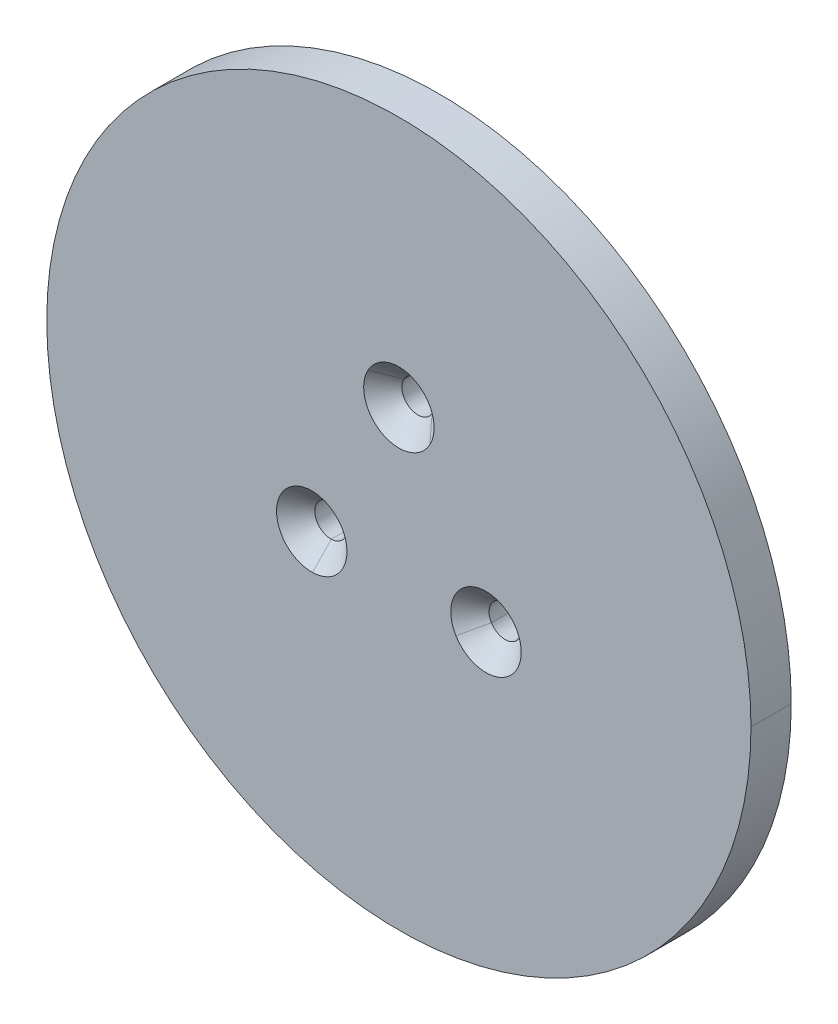
ISO-10303-21;
HEADER;
FILE_DESCRIPTION(('STEP AP214'),'2;1');
FILE_NAME('part.step','',(''),(''),'','','');
FILE_SCHEMA(('AUTOMOTIVE_DESIGN { 1 0 10303 214 1 1 1 1 }'));
ENDSEC;
DATA;
#1=APPLICATION_CONTEXT('core data for automotive mechanical design processes');
#2=APPLICATION_PROTOCOL_DEFINITION('international standard','automotive_design',2000,#1);
#3=PRODUCT_CONTEXT('',#1,'mechanical');
#4=PRODUCT('Part','Part','',(#3));
#5=PRODUCT_RELATED_PRODUCT_CATEGORY('part','',(#4));
#6=PRODUCT_DEFINITION_FORMATION('','',#4);
#7=PRODUCT_DEFINITION_CONTEXT('part definition',#1,'design');
#8=PRODUCT_DEFINITION('design','',#6,#7);
#9=PRODUCT_DEFINITION_SHAPE('','',#8);
#10=(LENGTH_UNIT() NAMED_UNIT(*) SI_UNIT(.MILLI.,.METRE.));
#11=(NAMED_UNIT(*) PLANE_ANGLE_UNIT() SI_UNIT($,.RADIAN.));
#12=(NAMED_UNIT(*) SI_UNIT($,.STERADIAN.) SOLID_ANGLE_UNIT());
#13=UNCERTAINTY_MEASURE_WITH_UNIT(LENGTH_MEASURE(1.E-05),#10,'distance_accuracy_value','');
#14=(GEOMETRIC_REPRESENTATION_CONTEXT(3) GLOBAL_UNCERTAINTY_ASSIGNED_CONTEXT((#13)) GLOBAL_UNIT_ASSIGNED_CONTEXT((#10,
#11,#12)) REPRESENTATION_CONTEXT('',''));
#15=CARTESIAN_POINT('',(0.,0.,0.));
#16=DIRECTION('',(0.,0.,1.));
#17=DIRECTION('',(1.,0.,0.));
#18=AXIS2_PLACEMENT_3D('',#15,#16,#17);
#19=CARTESIAN_POINT('',(0.,10.,2.1));
#20=DIRECTION('',(0.,0.,1.));
#21=DIRECTION('',(1.,0.,0.));
#22=AXIS2_PLACEMENT_3D('',#19,#20,#21);
#23=CONICAL_SURFACE('',#22,1.6,0.785398163397448);
#24=CARTESIAN_POINT('',(0.,10.,4.));
#25=DIRECTION('',(0.,0.,1.));
#26=DIRECTION('',(1.,0.,0.));
#27=AXIS2_PLACEMENT_3D('',#24,#25,#26);
#28=CIRCLE('',#27,3.5);
#29=CARTESIAN_POINT('',(3.0715389666163,8.32201061488529,4.));
#30=VERTEX_POINT('',#29);
#31=CARTESIAN_POINT('',(-3.07153896661631,11.6779893851147,4.));
#32=VERTEX_POINT('',#31);
#33=EDGE_CURVE('E10',#30,#32,#28,.T.);
#34=ORIENTED_EDGE('',*,*,#33,.T.);
#35=DIRECTION('',(-0.620544580563746,0.339005049421044,0.707106781186548));
#36=VECTOR('',#35,1.);
#37=CARTESIAN_POINT('',(-2.29988999087683,11.2564356283828,3.12071067811865));
#38=LINE('',#37,#36);
#39=CARTESIAN_POINT('',(-1.4041320990246,10.7670808617667,2.1));
#40=VERTEX_POINT('',#39);
#41=EDGE_CURVE('E40',#40,#32,#38,.T.);
#42=ORIENTED_EDGE('',*,*,#41,.F.);
#43=CARTESIAN_POINT('',(0.,10.,2.1));
#44=DIRECTION('',(0.,0.,-1.));
#45=DIRECTION('',(1.,0.,0.));
#46=AXIS2_PLACEMENT_3D('',#43,#44,#45);
#47=CIRCLE('',#46,1.6);
#48=CARTESIAN_POINT('',(1.40413209902459,9.23291913823327,2.1));
#49=VERTEX_POINT('',#48);
#50=EDGE_CURVE('E25',#40,#49,#47,.T.);
#51=ORIENTED_EDGE('',*,*,#50,.T.);
#52=DIRECTION('',(0.620544580563746,-0.339005049421045,0.707106781186548));
#53=VECTOR('',#52,1.);
#54=CARTESIAN_POINT('',(2.29988999087682,8.74356437161718,3.12071067811865));
#55=LINE('',#54,#53);
#56=EDGE_CURVE('E101',#49,#30,#55,.T.);
#57=ORIENTED_EDGE('',*,*,#56,.T.);
#58=EDGE_LOOP('',(#34,#42,#51,#57));
#59=FACE_BOUND('',#58,.T.);
#60=ADVANCED_FACE('F15',(#59),#23,.F.);
#61=CARTESIAN_POINT('',(0.,10.,2.1));
#62=DIRECTION('',(0.,0.,1.));
#63=DIRECTION('',(1.,0.,0.));
#64=AXIS2_PLACEMENT_3D('',#61,#62,#63);
#65=CONICAL_SURFACE('',#64,1.6,0.785398163397448);
#66=CARTESIAN_POINT('',(0.,10.,4.));
#67=DIRECTION('',(0.,0.,1.));
#68=DIRECTION('',(1.,0.,0.));
#69=AXIS2_PLACEMENT_3D('',#66,#67,#68);
#70=CIRCLE('',#69,3.5);
#71=EDGE_CURVE('E192',#32,#30,#70,.T.);
#72=ORIENTED_EDGE('',*,*,#71,.T.);
#73=ORIENTED_EDGE('',*,*,#56,.F.);
#74=CARTESIAN_POINT('',(0.,10.,2.1));
#75=DIRECTION('',(0.,0.,-1.));
#76=DIRECTION('',(1.,0.,0.));
#77=AXIS2_PLACEMENT_3D('',#74,#75,#76);
#78=CIRCLE('',#77,1.6);
#79=EDGE_CURVE('E91',#49,#40,#78,.T.);
#80=ORIENTED_EDGE('',*,*,#79,.T.);
#81=ORIENTED_EDGE('',*,*,#41,.T.);
#82=EDGE_LOOP('',(#72,#73,#80,#81));
#83=FACE_BOUND('',#82,.T.);
#84=ADVANCED_FACE('F312',(#83),#65,.F.);
#85=CARTESIAN_POINT('',(0.,10.,3.9));
#86=DIRECTION('',(0.,0.,1.));
#87=DIRECTION('',(1.,0.,0.));
#88=AXIS2_PLACEMENT_3D('',#85,#86,#87);
#89=CYLINDRICAL_SURFACE('',#88,1.6);
#90=CARTESIAN_POINT('',(0.,10.,0.));
#91=DIRECTION('',(0.,0.,1.));
#92=DIRECTION('',(1.,0.,0.));
#93=AXIS2_PLACEMENT_3D('',#90,#91,#92);
#94=CIRCLE('',#93,1.6);
#95=CARTESIAN_POINT('',(1.40413209902459,9.23291913823327,0.));
#96=VERTEX_POINT('',#95);
#97=CARTESIAN_POINT('',(-1.4041320990246,10.7670808617667,0.));
#98=VERTEX_POINT('',#97);
#99=EDGE_CURVE('E220',#96,#98,#94,.T.);
#100=ORIENTED_EDGE('',*,*,#99,.F.);
#101=DIRECTION('',(0.,0.,1.));
#102=VECTOR('',#101,1.);
#103=CARTESIAN_POINT('',(1.40413209902459,9.23291913823327,0.894999999975));
#104=LINE('',#103,#102);
#105=EDGE_CURVE('E207',#96,#49,#104,.T.);
#106=ORIENTED_EDGE('',*,*,#105,.T.);
#107=ORIENTED_EDGE('',*,*,#50,.F.);
#108=DIRECTION('',(0.,0.,1.));
#109=VECTOR('',#108,1.);
#110=CARTESIAN_POINT('',(-1.4041320990246,10.7670808617667,0.894999999975));
#111=LINE('',#110,#109);
#112=EDGE_CURVE('E189',#98,#40,#111,.T.);
#113=ORIENTED_EDGE('',*,*,#112,.F.);
#114=EDGE_LOOP('',(#100,#106,#107,#113));
#115=FACE_BOUND('',#114,.T.);
#116=ADVANCED_FACE('F267',(#115),#89,.F.);
#117=CARTESIAN_POINT('',(0.,10.,3.9));
#118=DIRECTION('',(0.,0.,1.));
#119=DIRECTION('',(1.,0.,0.));
#120=AXIS2_PLACEMENT_3D('',#117,#118,#119);
#121=CYLINDRICAL_SURFACE('',#120,1.6);
#122=CARTESIAN_POINT('',(0.,10.,0.));
#123=DIRECTION('',(0.,0.,1.));
#124=DIRECTION('',(1.,0.,0.));
#125=AXIS2_PLACEMENT_3D('',#122,#123,#124);
#126=CIRCLE('',#125,1.6);
#127=EDGE_CURVE('E216',#98,#96,#126,.T.);
#128=ORIENTED_EDGE('',*,*,#127,.F.);
#129=ORIENTED_EDGE('',*,*,#112,.T.);
#130=ORIENTED_EDGE('',*,*,#79,.F.);
#131=ORIENTED_EDGE('',*,*,#105,.F.);
#132=EDGE_LOOP('',(#128,#129,#130,#131));
#133=FACE_BOUND('',#132,.T.);
#134=ADVANCED_FACE('F320',(#133),#121,.F.);
#135=CARTESIAN_POINT('',(0.,0.,2.));
#136=DIRECTION('',(0.,0.,-1.));
#137=DIRECTION('',(1.,0.,0.));
#138=AXIS2_PLACEMENT_3D('',#135,#136,#137);
#139=CYLINDRICAL_SURFACE('',#138,35.);
#140=DIRECTION('',(0.,0.,1.));
#141=VECTOR('',#140,1.);
#142=CARTESIAN_POINT('',(35.,0.,2.));
#143=LINE('',#142,#141);
#144=CARTESIAN_POINT('',(35.,0.,0.));
#145=VERTEX_POINT('',#144);
#146=CARTESIAN_POINT('',(35.,0.,4.));
#147=VERTEX_POINT('',#146);
#148=EDGE_CURVE('E183',#145,#147,#143,.T.);
#149=ORIENTED_EDGE('',*,*,#148,.F.);
#150=CARTESIAN_POINT('',(0.,0.,0.));
#151=DIRECTION('',(0.,0.,1.));
#152=DIRECTION('',(1.,0.,0.));
#153=AXIS2_PLACEMENT_3D('',#150,#151,#152);
#154=CIRCLE('',#153,35.);
#155=CARTESIAN_POINT('',(-35.,0.,0.));
#156=VERTEX_POINT('',#155);
#157=EDGE_CURVE('E185',#145,#156,#154,.T.);
#158=ORIENTED_EDGE('',*,*,#157,.T.);
#159=DIRECTION('',(0.,0.,1.));
#160=VECTOR('',#159,1.);
#161=CARTESIAN_POINT('',(-35.,0.,2.));
#162=LINE('',#161,#160);
#163=CARTESIAN_POINT('',(-35.,0.,4.));
#164=VERTEX_POINT('',#163);
#165=EDGE_CURVE('E190',#156,#164,#162,.T.);
#166=ORIENTED_EDGE('',*,*,#165,.T.);
#167=CARTESIAN_POINT('',(0.,0.,4.));
#168=DIRECTION('',(0.,0.,1.));
#169=DIRECTION('',(1.,0.,0.));
#170=AXIS2_PLACEMENT_3D('',#167,#168,#169);
#171=CIRCLE('',#170,35.);
#172=EDGE_CURVE('E200',#147,#164,#171,.T.);
#173=ORIENTED_EDGE('',*,*,#172,.F.);
#174=EDGE_LOOP('',(#149,#158,#166,#173));
#175=FACE_BOUND('',#174,.T.);
#176=ADVANCED_FACE('F303',(#175),#139,.T.);
#177=CARTESIAN_POINT('',(0.,0.,2.));
#178=DIRECTION('',(0.,0.,-1.));
#179=DIRECTION('',(1.,0.,0.));
#180=AXIS2_PLACEMENT_3D('',#177,#178,#179);
#181=CYLINDRICAL_SURFACE('',#180,35.);
#182=ORIENTED_EDGE('',*,*,#165,.F.);
#183=CARTESIAN_POINT('',(0.,0.,0.));
#184=DIRECTION('',(0.,0.,1.));
#185=DIRECTION('',(1.,0.,0.));
#186=AXIS2_PLACEMENT_3D('',#183,#184,#185);
#187=CIRCLE('',#186,35.);
#188=EDGE_CURVE('E209',#156,#145,#187,.T.);
#189=ORIENTED_EDGE('',*,*,#188,.T.);
#190=ORIENTED_EDGE('',*,*,#148,.T.);
#191=CARTESIAN_POINT('',(0.,0.,4.));
#192=DIRECTION('',(0.,0.,1.));
#193=DIRECTION('',(1.,0.,0.));
#194=AXIS2_PLACEMENT_3D('',#191,#192,#193);
#195=CIRCLE('',#194,35.);
#196=EDGE_CURVE('E196',#164,#147,#195,.T.);
#197=ORIENTED_EDGE('',*,*,#196,.F.);
#198=EDGE_LOOP('',(#182,#189,#190,#197));
#199=FACE_BOUND('',#198,.T.);
#200=ADVANCED_FACE('F293',(#199),#181,.T.);
#201=CARTESIAN_POINT('',(0.,0.,0.));
#202=DIRECTION('',(0.,0.,1.));
#203=DIRECTION('',(1.,0.,0.));
#204=AXIS2_PLACEMENT_3D('',#201,#202,#203);
#205=PLANE('',#204);
#206=ORIENTED_EDGE('',*,*,#188,.F.);
#207=ORIENTED_EDGE('',*,*,#157,.F.);
#208=EDGE_LOOP('',(#206,#207));
#209=FACE_BOUND('',#208,.T.);
#210=ORIENTED_EDGE('',*,*,#99,.T.);
#211=ORIENTED_EDGE('',*,*,#127,.T.);
#212=EDGE_LOOP('',(#210,#211));
#213=FACE_BOUND('',#212,.T.);
#214=CARTESIAN_POINT('',(-8.66025403784439,-5.,0.));
#215=DIRECTION('',(0.,0.,1.));
#216=DIRECTION('',(1.,0.,0.));
#217=AXIS2_PLACEMENT_3D('',#214,#215,#216);
#218=CIRCLE('',#217,1.6);
#219=CARTESIAN_POINT('',(-8.62249950137893,-6.59955449890783,0.));
#220=VERTEX_POINT('',#219);
#221=CARTESIAN_POINT('',(-8.69800857430984,-3.40044550109217,0.));
#222=VERTEX_POINT('',#221);
#223=EDGE_CURVE('E213',#220,#222,#218,.T.);
#224=ORIENTED_EDGE('',*,*,#223,.T.);
#225=CARTESIAN_POINT('',(-8.66025403784439,-5.,0.));
#226=DIRECTION('',(0.,0.,1.));
#227=DIRECTION('',(1.,0.,0.));
#228=AXIS2_PLACEMENT_3D('',#225,#226,#227);
#229=CIRCLE('',#228,1.6);
#230=EDGE_CURVE('E116',#222,#220,#229,.T.);
#231=ORIENTED_EDGE('',*,*,#230,.T.);
#232=EDGE_LOOP('',(#224,#231));
#233=FACE_BOUND('',#232,.T.);
#234=CARTESIAN_POINT('',(8.66025403784439,-5.,0.));
#235=DIRECTION('',(0.,0.,1.));
#236=DIRECTION('',(1.,0.,0.));
#237=AXIS2_PLACEMENT_3D('',#234,#235,#236);
#238=CIRCLE('',#237,1.6);
#239=CARTESIAN_POINT('',(10.0266316004035,-4.16752636285889,0.));
#240=VERTEX_POINT('',#239);
#241=CARTESIAN_POINT('',(7.29387647528525,-5.8324736371411,0.));
#242=VERTEX_POINT('',#241);
#243=EDGE_CURVE('E199',#240,#242,#238,.T.);
#244=ORIENTED_EDGE('',*,*,#243,.T.);
#245=CARTESIAN_POINT('',(8.66025403784439,-5.,0.));
#246=DIRECTION('',(0.,0.,1.));
#247=DIRECTION('',(1.,0.,0.));
#248=AXIS2_PLACEMENT_3D('',#245,#246,#247);
#249=CIRCLE('',#248,1.6);
#250=EDGE_CURVE('E129',#242,#240,#249,.T.);
#251=ORIENTED_EDGE('',*,*,#250,.T.);
#252=EDGE_LOOP('',(#244,#251));
#253=FACE_BOUND('',#252,.T.);
#254=ADVANCED_FACE('F286',(#209,#213,#233,#253),#205,.F.);
#255=CARTESIAN_POINT('',(0.,0.,4.));
#256=DIRECTION('',(0.,0.,1.));
#257=DIRECTION('',(1.,0.,0.));
#258=AXIS2_PLACEMENT_3D('',#255,#256,#257);
#259=PLANE('',#258);
#260=ORIENTED_EDGE('',*,*,#172,.T.);
#261=ORIENTED_EDGE('',*,*,#196,.T.);
#262=EDGE_LOOP('',(#260,#261));
#263=FACE_BOUND('',#262,.T.);
#264=ORIENTED_EDGE('',*,*,#71,.F.);
#265=ORIENTED_EDGE('',*,*,#33,.F.);
#266=EDGE_LOOP('',(#264,#265));
#267=FACE_BOUND('',#266,.T.);
#268=CARTESIAN_POINT('',(-8.66025403784439,-5.,4.));
#269=DIRECTION('',(0.,0.,1.));
#270=DIRECTION('',(1.,0.,0.));
#271=AXIS2_PLACEMENT_3D('',#268,#269,#270);
#272=CIRCLE('',#271,3.5);
#273=CARTESIAN_POINT('',(-8.74284208636258,-1.50097453363913,4.));
#274=VERTEX_POINT('',#273);
#275=CARTESIAN_POINT('',(-8.5776659893262,-8.49902546636088,4.));
#276=VERTEX_POINT('',#275);
#277=EDGE_CURVE('E179',#274,#276,#272,.T.);
#278=ORIENTED_EDGE('',*,*,#277,.F.);
#279=CARTESIAN_POINT('',(-8.66025403784439,-5.,4.));
#280=DIRECTION('',(0.,0.,1.));
#281=DIRECTION('',(1.,0.,0.));
#282=AXIS2_PLACEMENT_3D('',#279,#280,#281);
#283=CIRCLE('',#282,3.5);
#284=EDGE_CURVE('E201',#276,#274,#283,.T.);
#285=ORIENTED_EDGE('',*,*,#284,.F.);
#286=EDGE_LOOP('',(#278,#285));
#287=FACE_BOUND('',#286,.T.);
#288=CARTESIAN_POINT('',(8.66025403784439,-5.,4.));
#289=DIRECTION('',(0.,0.,1.));
#290=DIRECTION('',(1.,0.,0.));
#291=AXIS2_PLACEMENT_3D('',#288,#289,#290);
#292=CIRCLE('',#291,3.5);
#293=CARTESIAN_POINT('',(5.67130311974627,-6.82103608124617,4.));
#294=VERTEX_POINT('',#293);
#295=CARTESIAN_POINT('',(11.6492049559425,-3.17896391875383,4.));
#296=VERTEX_POINT('',#295);
#297=EDGE_CURVE('E167',#294,#296,#292,.T.);
#298=ORIENTED_EDGE('',*,*,#297,.F.);
#299=CARTESIAN_POINT('',(8.66025403784439,-5.,4.));
#300=DIRECTION('',(0.,0.,1.));
#301=DIRECTION('',(1.,0.,0.));
#302=AXIS2_PLACEMENT_3D('',#299,#300,#301);
#303=CIRCLE('',#302,3.5);
#304=EDGE_CURVE('E151',#296,#294,#303,.T.);
#305=ORIENTED_EDGE('',*,*,#304,.F.);
#306=EDGE_LOOP('',(#298,#305));
#307=FACE_BOUND('',#306,.T.);
#308=ADVANCED_FACE('F292',(#263,#267,#287,#307),#259,.T.);
#309=CARTESIAN_POINT('',(8.66025403784439,-5.,2.1));
#310=DIRECTION('',(0.,0.,1.));
#311=DIRECTION('',(-0.5,-0.866025403784439,0.));
#312=AXIS2_PLACEMENT_3D('',#309,#310,#311);
#313=CONICAL_SURFACE('',#312,1.6,0.785398163397448);
#314=ORIENTED_EDGE('',*,*,#297,.T.);
#315=DIRECTION('',(0.603859275091696,0.367904846238441,0.707106781186548));
#316=VECTOR('',#315,1.);
#317=CARTESIAN_POINT('',(10.8983042056822,-3.63645465618252,3.12071067811865));
#318=LINE('',#317,#316);
#319=CARTESIAN_POINT('',(10.0266316004035,-4.16752636285889,2.1));
#320=VERTEX_POINT('',#319);
#321=EDGE_CURVE('E152',#320,#296,#318,.T.);
#322=ORIENTED_EDGE('',*,*,#321,.F.);
#323=CARTESIAN_POINT('',(8.66025403784439,-5.,2.1));
#324=DIRECTION('',(0.,0.,-1.));
#325=DIRECTION('',(-0.5,-0.866025403784439,0.));
#326=AXIS2_PLACEMENT_3D('',#323,#324,#325);
#327=CIRCLE('',#326,1.6);
#328=CARTESIAN_POINT('',(7.29387647528525,-5.8324736371411,2.1));
#329=VERTEX_POINT('',#328);
#330=EDGE_CURVE('E162',#320,#329,#327,.T.);
#331=ORIENTED_EDGE('',*,*,#330,.T.);
#332=DIRECTION('',(-0.603859275091697,-0.36790484623844,0.707106781186548));
#333=VECTOR('',#332,1.);
#334=CARTESIAN_POINT('',(6.42220387000659,-6.36354534381748,3.12071067811865));
#335=LINE('',#334,#333);
#336=EDGE_CURVE('E154',#329,#294,#335,.T.);
#337=ORIENTED_EDGE('',*,*,#336,.T.);
#338=EDGE_LOOP('',(#314,#322,#331,#337));
#339=FACE_BOUND('',#338,.T.);
#340=ADVANCED_FACE('F165',(#339),#313,.F.);
#341=CARTESIAN_POINT('',(8.66025403784439,-5.,2.1));
#342=DIRECTION('',(0.,0.,1.));
#343=DIRECTION('',(-0.5,-0.866025403784439,0.));
#344=AXIS2_PLACEMENT_3D('',#341,#342,#343);
#345=CONICAL_SURFACE('',#344,1.6,0.785398163397448);
#346=ORIENTED_EDGE('',*,*,#304,.T.);
#347=ORIENTED_EDGE('',*,*,#336,.F.);
#348=CARTESIAN_POINT('',(8.66025403784439,-5.,2.1));
#349=DIRECTION('',(0.,0.,-1.));
#350=DIRECTION('',(-0.5,-0.866025403784439,0.));
#351=AXIS2_PLACEMENT_3D('',#348,#349,#350);
#352=CIRCLE('',#351,1.6);
#353=EDGE_CURVE('E18',#329,#320,#352,.T.);
#354=ORIENTED_EDGE('',*,*,#353,.T.);
#355=ORIENTED_EDGE('',*,*,#321,.T.);
#356=EDGE_LOOP('',(#346,#347,#354,#355));
#357=FACE_BOUND('',#356,.T.);
#358=ADVANCED_FACE('F157',(#357),#345,.F.);
#359=CARTESIAN_POINT('',(8.66025403784439,-5.,3.9));
#360=DIRECTION('',(0.,0.,1.));
#361=DIRECTION('',(-0.5,-0.866025403784439,0.));
#362=AXIS2_PLACEMENT_3D('',#359,#360,#361);
#363=CYLINDRICAL_SURFACE('',#362,1.6);
#364=ORIENTED_EDGE('',*,*,#250,.F.);
#365=DIRECTION('',(0.,0.,1.));
#366=VECTOR('',#365,1.);
#367=CARTESIAN_POINT('',(7.29387647528525,-5.8324736371411,0.894999999975));
#368=LINE('',#367,#366);
#369=EDGE_CURVE('E145',#242,#329,#368,.T.);
#370=ORIENTED_EDGE('',*,*,#369,.T.);
#371=ORIENTED_EDGE('',*,*,#330,.F.);
#372=DIRECTION('',(0.,0.,1.));
#373=VECTOR('',#372,1.);
#374=CARTESIAN_POINT('',(10.0266316004035,-4.16752636285889,0.894999999975));
#375=LINE('',#374,#373);
#376=EDGE_CURVE('E146',#240,#320,#375,.T.);
#377=ORIENTED_EDGE('',*,*,#376,.F.);
#378=EDGE_LOOP('',(#364,#370,#371,#377));
#379=FACE_BOUND('',#378,.T.);
#380=ADVANCED_FACE('F170',(#379),#363,.F.);
#381=CARTESIAN_POINT('',(8.66025403784439,-5.,3.9));
#382=DIRECTION('',(0.,0.,1.));
#383=DIRECTION('',(-0.5,-0.866025403784439,0.));
#384=AXIS2_PLACEMENT_3D('',#381,#382,#383);
#385=CYLINDRICAL_SURFACE('',#384,1.6);
#386=ORIENTED_EDGE('',*,*,#243,.F.);
#387=ORIENTED_EDGE('',*,*,#376,.T.);
#388=ORIENTED_EDGE('',*,*,#353,.F.);
#389=ORIENTED_EDGE('',*,*,#369,.F.);
#390=EDGE_LOOP('',(#386,#387,#388,#389));
#391=FACE_BOUND('',#390,.T.);
#392=ADVANCED_FACE('F144',(#391),#385,.F.);
#393=CARTESIAN_POINT('',(-8.66025403784439,-5.,2.1));
#394=DIRECTION('',(0.,0.,1.));
#395=DIRECTION('',(-0.5,0.866025403784439,0.));
#396=AXIS2_PLACEMENT_3D('',#393,#394,#395);
#397=CONICAL_SURFACE('',#396,1.6,0.785398163397448);
#398=ORIENTED_EDGE('',*,*,#277,.T.);
#399=DIRECTION('',(0.0166853054720506,-0.706909895659485,0.707106781186548));
#400=VECTOR('',#399,1.);
#401=CARTESIAN_POINT('',(-8.59841421480536,-7.61998097220031,3.12071067811865));
#402=LINE('',#401,#400);
#403=CARTESIAN_POINT('',(-8.62249950137893,-6.59955449890783,2.1));
#404=VERTEX_POINT('',#403);
#405=EDGE_CURVE('E223',#404,#276,#402,.T.);
#406=ORIENTED_EDGE('',*,*,#405,.F.);
#407=CARTESIAN_POINT('',(-8.66025403784439,-5.,2.1));
#408=DIRECTION('',(0.,0.,-1.));
#409=DIRECTION('',(-0.5,0.866025403784439,0.));
#410=AXIS2_PLACEMENT_3D('',#407,#408,#409);
#411=CIRCLE('',#410,1.6);
#412=CARTESIAN_POINT('',(-8.69800857430984,-3.40044550109217,2.1));
#413=VERTEX_POINT('',#412);
#414=EDGE_CURVE('E238',#404,#413,#411,.T.);
#415=ORIENTED_EDGE('',*,*,#414,.T.);
#416=DIRECTION('',(-0.0166853054720494,0.706909895659485,0.707106781186548));
#417=VECTOR('',#416,1.);
#418=CARTESIAN_POINT('',(-8.72209386088341,-2.3800190277997,3.12071067811865));
#419=LINE('',#418,#417);
#420=EDGE_CURVE('E204',#413,#274,#419,.T.);
#421=ORIENTED_EDGE('',*,*,#420,.T.);
#422=EDGE_LOOP('',(#398,#406,#415,#421));
#423=FACE_BOUND('',#422,.T.);
#424=ADVANCED_FACE('F327',(#423),#397,.F.);
#425=CARTESIAN_POINT('',(-8.66025403784439,-5.,2.1));
#426=DIRECTION('',(0.,0.,1.));
#427=DIRECTION('',(-0.5,0.866025403784439,0.));
#428=AXIS2_PLACEMENT_3D('',#425,#426,#427);
#429=CONICAL_SURFACE('',#428,1.6,0.785398163397448);
#430=ORIENTED_EDGE('',*,*,#284,.T.);
#431=ORIENTED_EDGE('',*,*,#420,.F.);
#432=CARTESIAN_POINT('',(-8.66025403784439,-5.,2.1));
#433=DIRECTION('',(0.,0.,-1.));
#434=DIRECTION('',(-0.5,0.866025403784439,0.));
#435=AXIS2_PLACEMENT_3D('',#432,#433,#434);
#436=CIRCLE('',#435,1.6);
#437=EDGE_CURVE('E205',#413,#404,#436,.T.);
#438=ORIENTED_EDGE('',*,*,#437,.T.);
#439=ORIENTED_EDGE('',*,*,#405,.T.);
#440=EDGE_LOOP('',(#430,#431,#438,#439));
#441=FACE_BOUND('',#440,.T.);
#442=ADVANCED_FACE('F324',(#441),#429,.F.);
#443=CARTESIAN_POINT('',(-8.66025403784439,-5.,3.9));
#444=DIRECTION('',(0.,0.,1.));
#445=DIRECTION('',(-0.5,0.866025403784439,0.));
#446=AXIS2_PLACEMENT_3D('',#443,#444,#445);
#447=CYLINDRICAL_SURFACE('',#446,1.6);
#448=ORIENTED_EDGE('',*,*,#230,.F.);
#449=DIRECTION('',(0.,0.,1.));
#450=VECTOR('',#449,1.);
#451=CARTESIAN_POINT('',(-8.69800857430984,-3.40044550109217,0.894999999974999));
#452=LINE('',#451,#450);
#453=EDGE_CURVE('E227',#222,#413,#452,.T.);
#454=ORIENTED_EDGE('',*,*,#453,.T.);
#455=ORIENTED_EDGE('',*,*,#414,.F.);
#456=DIRECTION('',(0.,0.,1.));
#457=VECTOR('',#456,1.);
#458=CARTESIAN_POINT('',(-8.62249950137893,-6.59955449890783,0.894999999974999));
#459=LINE('',#458,#457);
#460=EDGE_CURVE('E249',#220,#404,#459,.T.);
#461=ORIENTED_EDGE('',*,*,#460,.F.);
#462=EDGE_LOOP('',(#448,#454,#455,#461));
#463=FACE_BOUND('',#462,.T.);
#464=ADVANCED_FACE('F326',(#463),#447,.F.);
#465=CARTESIAN_POINT('',(-8.66025403784439,-5.,3.9));
#466=DIRECTION('',(0.,0.,1.));
#467=DIRECTION('',(-0.5,0.866025403784439,0.));
#468=AXIS2_PLACEMENT_3D('',#465,#466,#467);
#469=CYLINDRICAL_SURFACE('',#468,1.6);
#470=ORIENTED_EDGE('',*,*,#223,.F.);
#471=ORIENTED_EDGE('',*,*,#460,.T.);
#472=ORIENTED_EDGE('',*,*,#437,.F.);
#473=ORIENTED_EDGE('',*,*,#453,.F.);
#474=EDGE_LOOP('',(#470,#471,#472,#473));
#475=FACE_BOUND('',#474,.T.);
#476=ADVANCED_FACE('F333',(#475),#469,.F.);
#477=CLOSED_SHELL('',(#60,#84,#116,#134,#176,#200,#254,#308,#340,#358,#380,#392,#424,#442,#464,#476));
#478=MANIFOLD_SOLID_BREP('B1',#477);
#479=ADVANCED_BREP_SHAPE_REPRESENTATION('',(#18,#478),#14);
#480=SHAPE_DEFINITION_REPRESENTATION(#9,#479);
ENDSEC;
END-ISO-10303-21;
